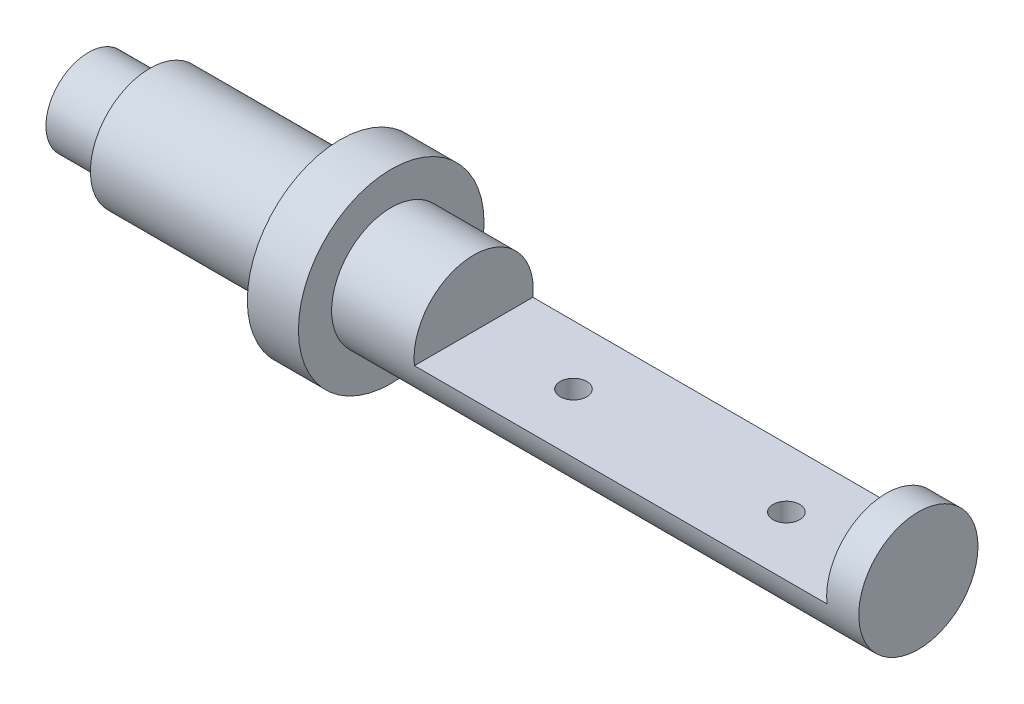
ISO-10303-21;
HEADER;
FILE_DESCRIPTION(('STEP AP214'),'2;1');
FILE_NAME('part.step','',(''),(''),'','','');
FILE_SCHEMA(('AUTOMOTIVE_DESIGN { 1 0 10303 214 1 1 1 1 }'));
ENDSEC;
DATA;
#1=APPLICATION_CONTEXT('core data for automotive mechanical design processes');
#2=APPLICATION_PROTOCOL_DEFINITION('international standard','automotive_design',2000,#1);
#3=PRODUCT_CONTEXT('',#1,'mechanical');
#4=PRODUCT('Part','Part','',(#3));
#5=PRODUCT_RELATED_PRODUCT_CATEGORY('part','',(#4));
#6=PRODUCT_DEFINITION_FORMATION('','',#4);
#7=PRODUCT_DEFINITION_CONTEXT('part definition',#1,'design');
#8=PRODUCT_DEFINITION('design','',#6,#7);
#9=PRODUCT_DEFINITION_SHAPE('','',#8);
#10=(LENGTH_UNIT() NAMED_UNIT(*) SI_UNIT(.MILLI.,.METRE.));
#11=(NAMED_UNIT(*) PLANE_ANGLE_UNIT() SI_UNIT($,.RADIAN.));
#12=(NAMED_UNIT(*) SI_UNIT($,.STERADIAN.) SOLID_ANGLE_UNIT());
#13=UNCERTAINTY_MEASURE_WITH_UNIT(LENGTH_MEASURE(1.E-05),#10,'distance_accuracy_value','');
#14=(GEOMETRIC_REPRESENTATION_CONTEXT(3) GLOBAL_UNCERTAINTY_ASSIGNED_CONTEXT((#13)) GLOBAL_UNIT_ASSIGNED_CONTEXT((#10,
#11,#12)) REPRESENTATION_CONTEXT('',''));
#15=CARTESIAN_POINT('',(0.,0.,0.));
#16=DIRECTION('',(0.,0.,1.));
#17=DIRECTION('',(1.,0.,0.));
#18=AXIS2_PLACEMENT_3D('',#15,#16,#17);
#19=CARTESIAN_POINT('',(0.,0.,0.));
#20=DIRECTION('',(-1.,0.,0.));
#21=DIRECTION('',(0.,0.,1.));
#22=AXIS2_PLACEMENT_3D('',#19,#20,#21);
#23=PLANE('',#22);
#24=CARTESIAN_POINT('',(0.,0.,0.));
#25=DIRECTION('',(1.,0.,0.));
#26=DIRECTION('',(0.,0.,-1.));
#27=AXIS2_PLACEMENT_3D('',#24,#25,#26);
#28=CIRCLE('',#27,20.);
#29=CARTESIAN_POINT('',(0.,0.,-20.));
#30=VERTEX_POINT('',#29);
#31=EDGE_CURVE('E107',#30,#30,#28,.T.);
#32=ORIENTED_EDGE('',*,*,#31,.F.);
#33=EDGE_LOOP('',(#32));
#34=FACE_BOUND('',#33,.T.);
#35=ADVANCED_FACE('F39',(#34),#23,.T.);
#36=CARTESIAN_POINT('',(389.8,0.,0.));
#37=DIRECTION('',(1.,0.,0.));
#38=DIRECTION('',(0.,0.,-1.));
#39=AXIS2_PLACEMENT_3D('',#36,#37,#38);
#40=CYLINDRICAL_SURFACE('',#39,20.);
#41=ORIENTED_EDGE('',*,*,#31,.T.);
#42=EDGE_LOOP('',(#41));
#43=FACE_BOUND('',#42,.T.);
#44=CARTESIAN_POINT('',(28.9,0.,0.));
#45=DIRECTION('',(1.,0.,0.));
#46=DIRECTION('',(0.,0.,-1.));
#47=AXIS2_PLACEMENT_3D('',#44,#45,#46);
#48=CIRCLE('',#47,20.);
#49=CARTESIAN_POINT('',(28.9,0.,-20.));
#50=VERTEX_POINT('',#49);
#51=EDGE_CURVE('E104',#50,#50,#48,.T.);
#52=ORIENTED_EDGE('',*,*,#51,.F.);
#53=EDGE_LOOP('',(#52));
#54=FACE_BOUND('',#53,.T.);
#55=ADVANCED_FACE('F157',(#43,#54),#40,.T.);
#56=CARTESIAN_POINT('',(28.9,20.,0.));
#57=DIRECTION('',(-1.,0.,0.));
#58=DIRECTION('',(0.,0.,1.));
#59=AXIS2_PLACEMENT_3D('',#56,#57,#58);
#60=PLANE('',#59);
#61=ORIENTED_EDGE('',*,*,#51,.T.);
#62=EDGE_LOOP('',(#61));
#63=FACE_BOUND('',#62,.T.);
#64=CARTESIAN_POINT('',(28.9,0.,0.));
#65=DIRECTION('',(1.,0.,0.));
#66=DIRECTION('',(0.,0.,-1.));
#67=AXIS2_PLACEMENT_3D('',#64,#65,#66);
#68=CIRCLE('',#67,28.);
#69=CARTESIAN_POINT('',(28.9,0.,-28.));
#70=VERTEX_POINT('',#69);
#71=EDGE_CURVE('E105',#70,#70,#68,.T.);
#72=ORIENTED_EDGE('',*,*,#71,.F.);
#73=EDGE_LOOP('',(#72));
#74=FACE_BOUND('',#73,.T.);
#75=ADVANCED_FACE('F163',(#63,#74),#60,.T.);
#76=CARTESIAN_POINT('',(389.8,0.,0.));
#77=DIRECTION('',(1.,0.,0.));
#78=DIRECTION('',(0.,0.,-1.));
#79=AXIS2_PLACEMENT_3D('',#76,#77,#78);
#80=CYLINDRICAL_SURFACE('',#79,28.);
#81=ORIENTED_EDGE('',*,*,#71,.T.);
#82=EDGE_LOOP('',(#81));
#83=FACE_BOUND('',#82,.T.);
#84=CARTESIAN_POINT('',(118.2,0.,0.));
#85=DIRECTION('',(1.,0.,0.));
#86=DIRECTION('',(0.,0.,-1.));
#87=AXIS2_PLACEMENT_3D('',#84,#85,#86);
#88=CIRCLE('',#87,28.);
#89=CARTESIAN_POINT('',(118.2,0.,-28.));
#90=VERTEX_POINT('',#89);
#91=EDGE_CURVE('E97',#90,#90,#88,.T.);
#92=ORIENTED_EDGE('',*,*,#91,.F.);
#93=EDGE_LOOP('',(#92));
#94=FACE_BOUND('',#93,.T.);
#95=ADVANCED_FACE('F175',(#83,#94),#80,.T.);
#96=CARTESIAN_POINT('',(118.2,28.,0.));
#97=DIRECTION('',(-1.,0.,0.));
#98=DIRECTION('',(0.,0.,1.));
#99=AXIS2_PLACEMENT_3D('',#96,#97,#98);
#100=PLANE('',#99);
#101=ORIENTED_EDGE('',*,*,#91,.T.);
#102=EDGE_LOOP('',(#101));
#103=FACE_BOUND('',#102,.T.);
#104=CARTESIAN_POINT('',(118.2,0.,0.));
#105=DIRECTION('',(1.,0.,0.));
#106=DIRECTION('',(0.,0.,-1.));
#107=AXIS2_PLACEMENT_3D('',#104,#105,#106);
#108=CIRCLE('',#107,43.6);
#109=CARTESIAN_POINT('',(118.2,0.,-43.6));
#110=VERTEX_POINT('',#109);
#111=EDGE_CURVE('E96',#110,#110,#108,.T.);
#112=ORIENTED_EDGE('',*,*,#111,.F.);
#113=EDGE_LOOP('',(#112));
#114=FACE_BOUND('',#113,.T.);
#115=ADVANCED_FACE('F179',(#103,#114),#100,.T.);
#116=CARTESIAN_POINT('',(389.8,0.,0.));
#117=DIRECTION('',(1.,0.,0.));
#118=DIRECTION('',(0.,0.,-1.));
#119=AXIS2_PLACEMENT_3D('',#116,#117,#118);
#120=CYLINDRICAL_SURFACE('',#119,43.6);
#121=ORIENTED_EDGE('',*,*,#111,.T.);
#122=EDGE_LOOP('',(#121));
#123=FACE_BOUND('',#122,.T.);
#124=CARTESIAN_POINT('',(142.2,0.,0.));
#125=DIRECTION('',(1.,0.,0.));
#126=DIRECTION('',(0.,0.,-1.));
#127=AXIS2_PLACEMENT_3D('',#124,#125,#126);
#128=CIRCLE('',#127,43.6);
#129=CARTESIAN_POINT('',(142.2,0.,-43.6));
#130=VERTEX_POINT('',#129);
#131=EDGE_CURVE('E89',#130,#130,#128,.T.);
#132=ORIENTED_EDGE('',*,*,#131,.F.);
#133=EDGE_LOOP('',(#132));
#134=FACE_BOUND('',#133,.T.);
#135=ADVANCED_FACE('F184',(#123,#134),#120,.T.);
#136=CARTESIAN_POINT('',(142.2,43.6,0.));
#137=DIRECTION('',(1.,0.,0.));
#138=DIRECTION('',(0.,0.,-1.));
#139=AXIS2_PLACEMENT_3D('',#136,#137,#138);
#140=PLANE('',#139);
#141=ORIENTED_EDGE('',*,*,#131,.T.);
#142=EDGE_LOOP('',(#141));
#143=FACE_BOUND('',#142,.T.);
#144=CARTESIAN_POINT('',(142.2,0.,0.));
#145=DIRECTION('',(1.,0.,0.));
#146=DIRECTION('',(0.,0.,-1.));
#147=AXIS2_PLACEMENT_3D('',#144,#145,#146);
#148=CIRCLE('',#147,28.);
#149=CARTESIAN_POINT('',(142.2,0.,-28.));
#150=VERTEX_POINT('',#149);
#151=EDGE_CURVE('E83',#150,#150,#148,.T.);
#152=ORIENTED_EDGE('',*,*,#151,.F.);
#153=EDGE_LOOP('',(#152));
#154=FACE_BOUND('',#153,.T.);
#155=ADVANCED_FACE('F76',(#143,#154),#140,.T.);
#156=CARTESIAN_POINT('',(389.8,0.,0.));
#157=DIRECTION('',(1.,0.,0.));
#158=DIRECTION('',(0.,0.,-1.));
#159=AXIS2_PLACEMENT_3D('',#156,#157,#158);
#160=CYLINDRICAL_SURFACE('',#159,28.);
#161=CARTESIAN_POINT('',(227.8,-27.2935431924841,6.25000000000001));
#162=CARTESIAN_POINT('',(227.626772759869,-27.2935406630598,6.25000418094473));
#163=CARTESIAN_POINT('',(227.453594583877,-27.295195294476,6.24279659776609));
#164=CARTESIAN_POINT('',(227.108445204921,-27.3017584796592,6.21403440350836));
#165=CARTESIAN_POINT('',(226.9364741812,-27.3066675067385,6.19247770552276));
#166=CARTESIAN_POINT('',(226.594963014681,-27.3195986301188,6.13517608334991));
#167=CARTESIAN_POINT('',(226.425423958102,-27.3276220751525,6.09942501198107));
#168=CARTESIAN_POINT('',(226.089985283219,-27.3465464155528,6.01400967245121));
#169=CARTESIAN_POINT('',(225.924087031793,-27.3574483722472,5.96434027208898));
#170=CARTESIAN_POINT('',(225.59739823919,-27.3817905916842,5.85156924300111));
#171=CARTESIAN_POINT('',(225.436600346177,-27.3952269869803,5.78848806167799));
#172=CARTESIAN_POINT('',(225.120879039308,-27.4242678496656,5.64929956777816));
#173=CARTESIAN_POINT('',(224.965957819931,-27.4398731170088,5.57318744653335));
#174=CARTESIAN_POINT('',(224.663139675886,-27.4728000717142,5.40853934345902));
#175=CARTESIAN_POINT('',(224.515239939892,-27.4901210633972,5.3200083911139));
#176=CARTESIAN_POINT('',(224.227304807542,-27.5260101395213,5.13108281812593));
#177=CARTESIAN_POINT('',(224.087272386179,-27.5445786899706,5.03068375356069));
#178=CARTESIAN_POINT('',(223.813935535353,-27.5827411710545,4.81708795276358));
#179=CARTESIAN_POINT('',(223.680768388947,-27.6023465077546,4.70371753740179));
#180=CARTESIAN_POINT('',(223.424367602939,-27.6417727676251,4.46619442991225));
#181=CARTESIAN_POINT('',(223.301137665901,-27.6615937680575,4.34203775433225));
#182=CARTESIAN_POINT('',(223.065523242344,-27.700889474895,4.08384197537747));
#183=CARTESIAN_POINT('',(222.953135671949,-27.7203642784752,3.94980570128881));
#184=CARTESIAN_POINT('',(222.739893741983,-27.7584430824459,3.67265674935637));
#185=CARTESIAN_POINT('',(222.639043646761,-27.7770467593695,3.52954074575632));
#186=CARTESIAN_POINT('',(222.448624564621,-27.813052346094,3.23365995739579));
#187=CARTESIAN_POINT('',(222.359186955487,-27.8304393713552,3.08080874634003));
#188=CARTESIAN_POINT('',(222.193497928413,-27.8633050823482,2.76785167600484));
#189=CARTESIAN_POINT('',(222.117251473738,-27.8787830491572,2.60774311456666));
#190=CARTESIAN_POINT('',(221.978606172387,-27.9073737582623,2.28150107379453));
#191=CARTESIAN_POINT('',(221.916200934247,-27.9204875917193,2.11537041669153));
#192=CARTESIAN_POINT('',(221.80567560503,-27.9439896454641,1.77823756423972));
#193=CARTESIAN_POINT('',(221.757560676261,-27.9543768806238,1.60723363283176));
#194=CARTESIAN_POINT('',(221.636694005375,-27.9806601200355,1.09439758323677));
#195=CARTESIAN_POINT('',(221.584988483422,-27.9921960538676,0.746994222027695));
#196=CARTESIAN_POINT('',(221.551534661022,-27.9996585490208,0.223520525139104));
#197=CARTESIAN_POINT('',(221.547741429726,-28.0005041840466,0.0485642360946108));
#198=CARTESIAN_POINT('',(221.554808971572,-27.9989265851301,-0.301058844425872));
#199=CARTESIAN_POINT('',(221.565669948848,-27.9965033056516,-0.475725631835141));
#200=CARTESIAN_POINT('',(221.619554977227,-27.9845298925051,-0.991080970449481));
#201=CARTESIAN_POINT('',(221.683476976027,-27.970364519702,-1.32971272514976));
#202=CARTESIAN_POINT('',(221.865716376935,-27.9310839487509,-1.99113945055508));
#203=CARTESIAN_POINT('',(221.984036304365,-27.9059682422566,-2.31393368526244));
#204=CARTESIAN_POINT('',(222.272613693557,-27.8472521946706,-2.93758195962187));
#205=CARTESIAN_POINT('',(222.443257248304,-27.813589111637,-3.23825157149131));
#206=CARTESIAN_POINT('',(222.831348644581,-27.7414625355303,-3.80704732566783));
#207=CARTESIAN_POINT('',(223.048803107967,-27.7029983636205,-4.07516885533361));
#208=CARTESIAN_POINT('',(223.529924683463,-27.6245113562129,-4.57738580559881));
#209=CARTESIAN_POINT('',(223.794490686191,-27.5844728055815,-4.81061849864796));
#210=CARTESIAN_POINT('',(224.359395719265,-27.5081274935843,-5.22957036099763));
#211=CARTESIAN_POINT('',(224.659735802028,-27.4718208420637,-5.41528813197722));
#212=CARTESIAN_POINT('',(225.28909832967,-27.4070063654905,-5.73434528879875));
#213=CARTESIAN_POINT('',(225.618209250125,-27.3785237986947,-5.86751562740583));
#214=CARTESIAN_POINT('',(226.294926272324,-27.3329281069129,-6.0763962250565));
#215=CARTESIAN_POINT('',(226.642529294842,-27.3158130954113,-6.15211601866804));
#216=CARTESIAN_POINT('',(227.338463469748,-27.2952766976966,-6.24259542089443));
#217=CARTESIAN_POINT('',(227.686622794773,-27.291572561069,-6.25861396727173));
#218=CARTESIAN_POINT('',(228.380637266418,-27.2975136372092,-6.23264970129104));
#219=CARTESIAN_POINT('',(228.726492576648,-27.3071578917232,-6.1906710524346));
#220=CARTESIAN_POINT('',(229.401658787116,-27.3384415167486,-6.05099829572651));
#221=CARTESIAN_POINT('',(229.731121853203,-27.3599303668854,-5.95400289682964));
#222=CARTESIAN_POINT('',(230.369119561196,-27.4123452195023,-5.70780773520875));
#223=CARTESIAN_POINT('',(230.677652128473,-27.4432721558189,-5.558602806482));
#224=CARTESIAN_POINT('',(231.270462153433,-27.5116960387506,-5.20947386615225));
#225=CARTESIAN_POINT('',(231.55427323904,-27.5492900747217,-5.00877748022631));
#226=CARTESIAN_POINT('',(232.084653800083,-27.6265592430673,-4.56335143969626));
#227=CARTESIAN_POINT('',(232.331218441614,-27.6662346446661,-4.31861607865893));
#228=CARTESIAN_POINT('',(232.78500466893,-27.7441297258463,-3.78641602648046));
#229=CARTESIAN_POINT('',(232.99136592114,-27.7823059698252,-3.49821158905157));
#230=CARTESIAN_POINT('',(233.352791761544,-27.8520981732881,-2.89029963896414));
#231=CARTESIAN_POINT('',(233.507858796504,-27.8837144456601,-2.57059362989548));
#232=CARTESIAN_POINT('',(233.697887719815,-27.9234467514472,-2.07570333708503));
#233=CARTESIAN_POINT('',(233.754038169116,-27.9353862929346,-1.90866854996698));
#234=CARTESIAN_POINT('',(233.852074197087,-27.9564443638961,-1.5703062834102));
#235=CARTESIAN_POINT('',(233.893965069283,-27.9655639400989,-1.39898042234163));
#236=CARTESIAN_POINT('',(233.963133940246,-27.9807181181667,-1.05326831573393));
#237=CARTESIAN_POINT('',(233.990410923789,-27.986752505703,-0.878881858444737));
#238=CARTESIAN_POINT('',(234.030124734713,-27.9955635060913,-0.528347318502385));
#239=CARTESIAN_POINT('',(234.042562155382,-27.9983402491843,-0.352199306560331));
#240=CARTESIAN_POINT('',(234.052382704856,-28.0005315872801,-0.00328258899926737));
#241=CARTESIAN_POINT('',(234.050085760547,-28.0000176335598,0.169476763448733));
#242=CARTESIAN_POINT('',(234.031205252523,-27.995809223028,0.514171279855253));
#243=CARTESIAN_POINT('',(234.014621979942,-27.9921148310289,0.686106460537331));
#244=CARTESIAN_POINT('',(233.967300889138,-27.9816470037884,1.02794898351234));
#245=CARTESIAN_POINT('',(233.936560840508,-27.9748730833677,1.19785600193809));
#246=CARTESIAN_POINT('',(233.861186498783,-27.9584357777394,1.53435186906264));
#247=CARTESIAN_POINT('',(233.816557147495,-27.9487734202847,1.70094187555776));
#248=CARTESIAN_POINT('',(233.71391333612,-27.9268574568711,2.02918872938449));
#249=CARTESIAN_POINT('',(233.655941549387,-27.9146121223051,2.19085948233514));
#250=CARTESIAN_POINT('',(233.526996614568,-27.8878471112107,2.50866639727834));
#251=CARTESIAN_POINT('',(233.456028036642,-27.8733282344044,2.66480448180282));
#252=CARTESIAN_POINT('',(233.301559769507,-27.8423945526457,2.97063998638385));
#253=CARTESIAN_POINT('',(233.218054753125,-27.825978942391,3.12033463343336));
#254=CARTESIAN_POINT('',(233.039153331803,-27.7916988602937,3.41219288944288));
#255=CARTESIAN_POINT('',(232.943760941799,-27.7738348783443,3.55435901815253));
#256=CARTESIAN_POINT('',(232.739680676553,-27.7367568229686,3.8330774015288));
#257=CARTESIAN_POINT('',(232.630764581969,-27.7175228620527,3.96945995543578));
#258=CARTESIAN_POINT('',(232.401992902721,-27.67856827949,4.23255724998559));
#259=CARTESIAN_POINT('',(232.282141120766,-27.6588478287394,4.35927532336926));
#260=CARTESIAN_POINT('',(232.032190697746,-27.6194442852869,4.60233284521467));
#261=CARTESIAN_POINT('',(231.902085955803,-27.5997612220746,4.71866602514742));
#262=CARTESIAN_POINT('',(231.632602018594,-27.5609972321727,4.94004645388393));
#263=CARTESIAN_POINT('',(231.493226229135,-27.5419160881187,5.04509781049819));
#264=CARTESIAN_POINT('',(231.203995171382,-27.5046146614129,5.24467646780602));
#265=CARTESIAN_POINT('',(231.054017467704,-27.4864108262582,5.33902953184628));
#266=CARTESIAN_POINT('',(230.746502220708,-27.4517038520394,5.51470510633685));
#267=CARTESIAN_POINT('',(230.588967489404,-27.4352000874544,5.59603241561453));
#268=CARTESIAN_POINT('',(230.267459281152,-27.4043843599853,5.74504238460735));
#269=CARTESIAN_POINT('',(230.103489319597,-27.3900712207976,5.81273237339837));
#270=CARTESIAN_POINT('',(229.77025885759,-27.364060344737,5.93397254806087));
#271=CARTESIAN_POINT('',(229.6009992932,-27.3523621480711,5.987525220039));
#272=CARTESIAN_POINT('',(229.164711263261,-27.3263643748796,6.10534932009698));
#273=CARTESIAN_POINT('',(228.894756275629,-27.3141314337926,6.15951030297508));
#274=CARTESIAN_POINT('',(228.349826175448,-27.2977230622745,6.2318313742948));
#275=CARTESIAN_POINT('',(228.074851329116,-27.2935472058001,6.24999336629613));
#276=CARTESIAN_POINT('',(227.8,-27.2935431924841,6.25000000000001));
#277=B_SPLINE_CURVE_WITH_KNOTS('',3,(#161,#162,#163,#164,#165,#166,#167,#168,#169,#170,#171,
#172,#173,#174,#175,#176,#177,#178,#179,#180,#181,#182,#183,#184,#185,#186,#187,#188,#189,#190,
#191,#192,#193,#194,#195,#196,#197,#198,#199,#200,#201,#202,#203,#204,#205,#206,#207,#208,#209,
#210,#211,#212,#213,#214,#215,#216,#217,#218,#219,#220,#221,#222,#223,#224,#225,#226,#227,#228,
#229,#230,#231,#232,#233,#234,#235,#236,#237,#238,#239,#240,#241,#242,#243,#244,#245,#246,#247,
#248,#249,#250,#251,#252,#253,#254,#255,#256,#257,#258,#259,#260,#261,#262,#263,#264,#265,#266,
#267,#268,#269,#270,#271,#272,#273,#274,#275,#276),.UNSPECIFIED.,.T.,.F.,(4,2,2,2,2,2,2,2,2,2,2,
2,2,2,2,2,2,2,2,2,2,2,2,2,2,2,2,2,2,2,2,2,2,2,2,2,2,2,2,2,2,2,2,2,2,2,2,2,2,2,2,2,2,2,2,2,2,4),
(0.,0.519439608500111,1.0389547797675,1.55869518419964,2.07862748884636,2.59777272482057,
3.1171099499522,3.63623745343965,4.1555599596157,4.68290174643604,5.21043911948483,
5.73782600077029,6.26540718315176,6.79859906273959,7.33199112529032,7.86513636801498,
8.39847397341277,9.44659898859371,9.97108019976339,10.4955687170816,11.5250017072293,
12.5544824917318,13.5917504134608,14.6291651632887,15.6890487552905,16.7489635351156,
17.8122608342571,18.8753816285583,19.9159529707268,20.9564496162611,21.9840187566687,
23.0116896012437,24.0557822772237,25.10001034103,26.1645877935076,27.229114457624,
27.7584522517355,28.2875933270914,28.8167711569939,29.3459278295956,29.8636344148691,
30.3813304503266,30.8991080770091,31.4167016888243,31.9326623270648,32.4484418813475,
32.9644412321529,33.4802667751747,34.0064342303606,34.5324194115064,35.0587199707588,
35.5848282449849,36.1185476697549,36.6520700120354,37.1853048551527,37.7184458641198,
38.542659288208,39.3668291282597),.UNSPECIFIED.);
#278=CARTESIAN_POINT('',(227.8,-27.2935431924841,6.25000000000001));
#279=VERTEX_POINT('',#278);
#280=EDGE_CURVE('E118',#279,#279,#277,.T.);
#281=ORIENTED_EDGE('',*,*,#280,.F.);
#282=EDGE_LOOP('',(#281));
#283=FACE_BOUND('',#282,.T.);
#284=CARTESIAN_POINT('',(327.8,-27.2935431924841,6.25000000000003));
#285=CARTESIAN_POINT('',(327.626772759869,-27.2935406630598,6.25000418094476));
#286=CARTESIAN_POINT('',(327.453594583877,-27.295195294476,6.24279659776612));
#287=CARTESIAN_POINT('',(327.108445204921,-27.3017584796592,6.21403440350839));
#288=CARTESIAN_POINT('',(326.9364741812,-27.3066675067385,6.19247770552278));
#289=CARTESIAN_POINT('',(326.594963014681,-27.3195986301188,6.13517608334994));
#290=CARTESIAN_POINT('',(326.425423958102,-27.3276220751525,6.09942501198109));
#291=CARTESIAN_POINT('',(326.089985283219,-27.3465464155528,6.01400967245123));
#292=CARTESIAN_POINT('',(325.924087031793,-27.3574483722472,5.964340272089));
#293=CARTESIAN_POINT('',(325.59739823919,-27.3817905916842,5.85156924300113));
#294=CARTESIAN_POINT('',(325.436600346177,-27.3952269869803,5.78848806167802));
#295=CARTESIAN_POINT('',(325.120879039308,-27.4242678496656,5.64929956777819));
#296=CARTESIAN_POINT('',(324.965957819931,-27.4398731170088,5.57318744653339));
#297=CARTESIAN_POINT('',(324.663139675886,-27.4728000717142,5.40853934345906));
#298=CARTESIAN_POINT('',(324.515239939892,-27.4901210633972,5.32000839111395));
#299=CARTESIAN_POINT('',(324.227304807542,-27.5260101395213,5.13108281812598));
#300=CARTESIAN_POINT('',(324.087272386179,-27.5445786899706,5.03068375356074));
#301=CARTESIAN_POINT('',(323.813935535353,-27.5827411710544,4.81708795276363));
#302=CARTESIAN_POINT('',(323.680768388947,-27.6023465077546,4.70371753740185));
#303=CARTESIAN_POINT('',(323.424367602939,-27.6417727676251,4.46619442991232));
#304=CARTESIAN_POINT('',(323.301137665901,-27.6615937680575,4.3420377543323));
#305=CARTESIAN_POINT('',(323.065523242344,-27.700889474895,4.08384197537751));
#306=CARTESIAN_POINT('',(322.953135671949,-27.7203642784752,3.94980570128885));
#307=CARTESIAN_POINT('',(322.739893741983,-27.7584430824459,3.67265674935641));
#308=CARTESIAN_POINT('',(322.639043646761,-27.7770467593695,3.52954074575636));
#309=CARTESIAN_POINT('',(322.448624564621,-27.813052346094,3.23365995739585));
#310=CARTESIAN_POINT('',(322.359186955487,-27.8304393713551,3.08080874634009));
#311=CARTESIAN_POINT('',(322.193497928413,-27.8633050823482,2.7678516760049));
#312=CARTESIAN_POINT('',(322.117251473738,-27.8787830491572,2.60774311456671));
#313=CARTESIAN_POINT('',(321.978606172387,-27.9073737582623,2.28150107379458));
#314=CARTESIAN_POINT('',(321.916200934247,-27.9204875917193,2.11537041669158));
#315=CARTESIAN_POINT('',(321.80567560503,-27.9439896454641,1.77823756423976));
#316=CARTESIAN_POINT('',(321.757560676261,-27.9543768806238,1.6072336328318));
#317=CARTESIAN_POINT('',(321.636694005375,-27.9806601200355,1.09439758323679));
#318=CARTESIAN_POINT('',(321.584988483422,-27.9921960538676,0.746994222027709));
#319=CARTESIAN_POINT('',(321.551534661022,-27.9996585490208,0.223520525139109));
#320=CARTESIAN_POINT('',(321.547741429726,-28.0005041840466,0.0485642360946131));
#321=CARTESIAN_POINT('',(321.554808971572,-27.9989265851301,-0.301058844425877));
#322=CARTESIAN_POINT('',(321.565669948848,-27.9965033056516,-0.47572563183515));
#323=CARTESIAN_POINT('',(321.619554977227,-27.9845298925051,-0.991080970449496));
#324=CARTESIAN_POINT('',(321.683476976027,-27.970364519702,-1.32971272514978));
#325=CARTESIAN_POINT('',(321.865716376935,-27.9310839487509,-1.9911394505551));
#326=CARTESIAN_POINT('',(321.984036304365,-27.9059682422566,-2.31393368526247));
#327=CARTESIAN_POINT('',(322.272613693557,-27.8472521946706,-2.93758195962189));
#328=CARTESIAN_POINT('',(322.443257248304,-27.813589111637,-3.23825157149134));
#329=CARTESIAN_POINT('',(322.831348644581,-27.7414625355303,-3.80704732566786));
#330=CARTESIAN_POINT('',(323.048803107967,-27.7029983636205,-4.07516885533364));
#331=CARTESIAN_POINT('',(323.529924683463,-27.6245113562129,-4.57738580559885));
#332=CARTESIAN_POINT('',(323.794490686192,-27.5844728055815,-4.81061849864799));
#333=CARTESIAN_POINT('',(324.359395719265,-27.5081274935843,-5.22957036099767));
#334=CARTESIAN_POINT('',(324.659735802028,-27.4718208420637,-5.41528813197726));
#335=CARTESIAN_POINT('',(325.28909832967,-27.4070063654905,-5.73434528879879));
#336=CARTESIAN_POINT('',(325.618209250125,-27.3785237986947,-5.86751562740587));
#337=CARTESIAN_POINT('',(326.294926272324,-27.3329281069129,-6.07639622505653));
#338=CARTESIAN_POINT('',(326.642529294842,-27.3158130954113,-6.15211601866807));
#339=CARTESIAN_POINT('',(327.338463469748,-27.2952766976966,-6.24259542089446));
#340=CARTESIAN_POINT('',(327.686622794773,-27.291572561069,-6.25861396727175));
#341=CARTESIAN_POINT('',(328.380637266418,-27.2975136372092,-6.23264970129107));
#342=CARTESIAN_POINT('',(328.726492576648,-27.3071578917232,-6.19067105243462));
#343=CARTESIAN_POINT('',(329.401658787116,-27.3384415167486,-6.05099829572654));
#344=CARTESIAN_POINT('',(329.731121853203,-27.3599303668854,-5.95400289682967));
#345=CARTESIAN_POINT('',(330.369119561196,-27.4123452195023,-5.70780773520877));
#346=CARTESIAN_POINT('',(330.677652128473,-27.4432721558189,-5.55860280648202));
#347=CARTESIAN_POINT('',(331.270462153433,-27.5116960387506,-5.20947386615228));
#348=CARTESIAN_POINT('',(331.554273239041,-27.5492900747216,-5.00877748022635));
#349=CARTESIAN_POINT('',(332.084653800083,-27.6265592430672,-4.5633514396963));
#350=CARTESIAN_POINT('',(332.331218441614,-27.6662346446661,-4.31861607865894));
#351=CARTESIAN_POINT('',(332.78500466893,-27.7441297258462,-3.78641602648045));
#352=CARTESIAN_POINT('',(332.99136592114,-27.7823059698252,-3.49821158905157));
#353=CARTESIAN_POINT('',(333.352791761544,-27.8520981732881,-2.89029963896414));
#354=CARTESIAN_POINT('',(333.507858796504,-27.8837144456601,-2.57059362989546));
#355=CARTESIAN_POINT('',(333.697887719815,-27.9234467514472,-2.075703337085));
#356=CARTESIAN_POINT('',(333.754038169116,-27.9353862929346,-1.90866854996695));
#357=CARTESIAN_POINT('',(333.852074197087,-27.9564443638961,-1.57030628341017));
#358=CARTESIAN_POINT('',(333.893965069283,-27.9655639400989,-1.39898042234161));
#359=CARTESIAN_POINT('',(333.963133940246,-27.9807181181667,-1.05326831573391));
#360=CARTESIAN_POINT('',(333.990410923789,-27.986752505703,-0.87888185844472));
#361=CARTESIAN_POINT('',(334.030124734713,-27.9955635060913,-0.528347318502367));
#362=CARTESIAN_POINT('',(334.042562155382,-27.9983402491843,-0.352199306560314));
#363=CARTESIAN_POINT('',(334.052382704856,-28.0005315872801,-0.00328258899925384));
#364=CARTESIAN_POINT('',(334.050085760547,-28.0000176335598,0.169476763448743));
#365=CARTESIAN_POINT('',(334.031205252523,-27.995809223028,0.514171279855259));
#366=CARTESIAN_POINT('',(334.014621979942,-27.9921148310289,0.686106460537337));
#367=CARTESIAN_POINT('',(333.967300889138,-27.9816470037884,1.02794898351235));
#368=CARTESIAN_POINT('',(333.936560840508,-27.9748730833677,1.1978560019381));
#369=CARTESIAN_POINT('',(333.861186498783,-27.9584357777394,1.53435186906265));
#370=CARTESIAN_POINT('',(333.816557147495,-27.9487734202847,1.70094187555778));
#371=CARTESIAN_POINT('',(333.71391333612,-27.9268574568711,2.02918872938451));
#372=CARTESIAN_POINT('',(333.655941549387,-27.9146121223051,2.19085948233516));
#373=CARTESIAN_POINT('',(333.526996614568,-27.8878471112107,2.50866639727836));
#374=CARTESIAN_POINT('',(333.456028036642,-27.8733282344044,2.66480448180285));
#375=CARTESIAN_POINT('',(333.301559769507,-27.8423945526457,2.9706399863839));
#376=CARTESIAN_POINT('',(333.218054753125,-27.825978942391,3.12033463343341));
#377=CARTESIAN_POINT('',(333.039153331803,-27.7916988602937,3.41219288944293));
#378=CARTESIAN_POINT('',(332.943760941799,-27.7738348783443,3.55435901815256));
#379=CARTESIAN_POINT('',(332.739680676553,-27.7367568229686,3.83307740152882));
#380=CARTESIAN_POINT('',(332.63076458197,-27.7175228620527,3.9694599554358));
#381=CARTESIAN_POINT('',(332.401992902721,-27.67856827949,4.23255724998561));
#382=CARTESIAN_POINT('',(332.282141120766,-27.6588478287394,4.35927532336929));
#383=CARTESIAN_POINT('',(332.032190697746,-27.6194442852869,4.60233284521469));
#384=CARTESIAN_POINT('',(331.902085955803,-27.5997612220746,4.71866602514742));
#385=CARTESIAN_POINT('',(331.632602018594,-27.5609972321727,4.94004645388394));
#386=CARTESIAN_POINT('',(331.493226229136,-27.5419160881187,5.0450978104982));
#387=CARTESIAN_POINT('',(331.203995171382,-27.5046146614129,5.24467646780604));
#388=CARTESIAN_POINT('',(331.054017467704,-27.4864108262582,5.3390295318463));
#389=CARTESIAN_POINT('',(330.746502220708,-27.4517038520394,5.51470510633687));
#390=CARTESIAN_POINT('',(330.588967489404,-27.4352000874544,5.59603241561455));
#391=CARTESIAN_POINT('',(330.267459281153,-27.4043843599853,5.74504238460738));
#392=CARTESIAN_POINT('',(330.103489319597,-27.3900712207976,5.8127323733984));
#393=CARTESIAN_POINT('',(329.77025885759,-27.364060344737,5.93397254806091));
#394=CARTESIAN_POINT('',(329.6009992932,-27.3523621480711,5.98752522003903));
#395=CARTESIAN_POINT('',(329.164711263261,-27.3263643748796,6.10534932009699));
#396=CARTESIAN_POINT('',(328.894756275629,-27.3141314337926,6.15951030297511));
#397=CARTESIAN_POINT('',(328.349826175448,-27.2977230622745,6.23183137429483));
#398=CARTESIAN_POINT('',(328.074851329116,-27.2935472058001,6.24999336629615));
#399=CARTESIAN_POINT('',(327.8,-27.2935431924841,6.25000000000003));
#400=B_SPLINE_CURVE_WITH_KNOTS('',3,(#284,#285,#286,#287,#288,#289,#290,#291,#292,#293,#294,
#295,#296,#297,#298,#299,#300,#301,#302,#303,#304,#305,#306,#307,#308,#309,#310,#311,#312,#313,
#314,#315,#316,#317,#318,#319,#320,#321,#322,#323,#324,#325,#326,#327,#328,#329,#330,#331,#332,
#333,#334,#335,#336,#337,#338,#339,#340,#341,#342,#343,#344,#345,#346,#347,#348,#349,#350,#351,
#352,#353,#354,#355,#356,#357,#358,#359,#360,#361,#362,#363,#364,#365,#366,#367,#368,#369,#370,
#371,#372,#373,#374,#375,#376,#377,#378,#379,#380,#381,#382,#383,#384,#385,#386,#387,#388,#389,
#390,#391,#392,#393,#394,#395,#396,#397,#398,#399),.UNSPECIFIED.,.T.,.F.,(4,2,2,2,2,2,2,2,2,2,2,
2,2,2,2,2,2,2,2,2,2,2,2,2,2,2,2,2,2,2,2,2,2,2,2,2,2,2,2,2,2,2,2,2,2,2,2,2,2,2,2,2,2,2,2,2,2,4),
(0.,0.519439608500111,1.03895477976747,1.55869518419967,2.07862748884639,2.59777272482059,
3.11710994995217,3.6362374534396,4.15555995961564,4.68290174643602,5.21043911948482,
5.73782600077029,6.26540718315175,6.79859906273955,7.33199112529028,7.86513636801497,
8.39847397341278,9.44659898859374,9.97108019976343,10.4955687170816,11.5250017072293,
12.5544824917318,13.5917504134609,14.6291651632888,15.6890487552907,16.7489635351157,
17.8122608342572,18.8753816285584,19.9159529707268,20.9564496162612,21.9840187566688,
23.0116896012438,24.0557822772238,25.1000103410301,26.1645877935078,27.2291144576241,
27.7584522517357,28.2875933270915,28.816771156994,29.3459278295958,29.8636344148692,
30.3813304503267,30.8991080770092,31.4167016888245,31.932662327065,32.4484418813477,
32.964441232153,33.4802667751749,34.0064342303608,34.5324194115066,35.0587199707589,
35.5848282449851,36.1185476697551,36.6520700120356,37.1853048551529,37.71844586412,
38.5426592882081,39.3668291282599),.UNSPECIFIED.);
#401=CARTESIAN_POINT('',(327.8,-27.2935431924841,6.25000000000003));
#402=VERTEX_POINT('',#401);
#403=EDGE_CURVE('E114',#402,#402,#400,.T.);
#404=ORIENTED_EDGE('',*,*,#403,.F.);
#405=EDGE_LOOP('',(#404));
#406=FACE_BOUND('',#405,.T.);
#407=DIRECTION('',(1.,0.,0.));
#408=VECTOR('',#407,1.);
#409=CARTESIAN_POINT('',(389.8,-3.10000000000005,-27.8278637340346));
#410=LINE('',#409,#408);
#411=CARTESIAN_POINT('',(374.7,-3.10000000000005,-27.8278637340346));
#412=VERTEX_POINT('',#411);
#413=CARTESIAN_POINT('',(180.9,-3.10000000000005,-27.8278637340346));
#414=VERTEX_POINT('',#413);
#415=EDGE_CURVE('E11',#412,#414,#410,.F.);
#416=ORIENTED_EDGE('',*,*,#415,.F.);
#417=CARTESIAN_POINT('',(374.7,0.,0.));
#418=DIRECTION('',(1.,0.,0.));
#419=DIRECTION('',(0.,0.,-1.));
#420=AXIS2_PLACEMENT_3D('',#417,#418,#419);
#421=CIRCLE('',#420,28.);
#422=CARTESIAN_POINT('',(374.7,-3.10000000000005,27.8278637340346));
#423=VERTEX_POINT('',#422);
#424=EDGE_CURVE('E67',#423,#412,#421,.F.);
#425=ORIENTED_EDGE('',*,*,#424,.F.);
#426=DIRECTION('',(1.,0.,0.));
#427=VECTOR('',#426,1.);
#428=CARTESIAN_POINT('',(389.8,-3.10000000000005,27.8278637340346));
#429=LINE('',#428,#427);
#430=CARTESIAN_POINT('',(180.9,-3.10000000000005,27.8278637340346));
#431=VERTEX_POINT('',#430);
#432=EDGE_CURVE('E68',#431,#423,#429,.T.);
#433=ORIENTED_EDGE('',*,*,#432,.F.);
#434=CARTESIAN_POINT('',(180.9,0.,0.));
#435=DIRECTION('',(-1.,0.,0.));
#436=DIRECTION('',(0.,0.,1.));
#437=AXIS2_PLACEMENT_3D('',#434,#435,#436);
#438=CIRCLE('',#437,28.);
#439=EDGE_CURVE('E46',#414,#431,#438,.F.);
#440=ORIENTED_EDGE('',*,*,#439,.F.);
#441=EDGE_LOOP('',(#416,#425,#433,#440));
#442=FACE_BOUND('',#441,.T.);
#443=ORIENTED_EDGE('',*,*,#151,.T.);
#444=EDGE_LOOP('',(#443));
#445=FACE_BOUND('',#444,.T.);
#446=CARTESIAN_POINT('',(389.8,0.,0.));
#447=DIRECTION('',(1.,0.,0.));
#448=DIRECTION('',(0.,0.,-1.));
#449=AXIS2_PLACEMENT_3D('',#446,#447,#448);
#450=CIRCLE('',#449,28.);
#451=CARTESIAN_POINT('',(389.8,0.,-28.));
#452=VERTEX_POINT('',#451);
#453=EDGE_CURVE('E71',#452,#452,#450,.T.);
#454=ORIENTED_EDGE('',*,*,#453,.F.);
#455=EDGE_LOOP('',(#454));
#456=FACE_BOUND('',#455,.T.);
#457=ADVANCED_FACE('F73',(#283,#406,#442,#445,#456),#160,.T.);
#458=CARTESIAN_POINT('',(389.8,28.,0.));
#459=DIRECTION('',(1.,0.,0.));
#460=DIRECTION('',(0.,0.,-1.));
#461=AXIS2_PLACEMENT_3D('',#458,#459,#460);
#462=PLANE('',#461);
#463=ORIENTED_EDGE('',*,*,#453,.T.);
#464=EDGE_LOOP('',(#463));
#465=FACE_BOUND('',#464,.T.);
#466=ADVANCED_FACE('F79',(#465),#462,.T.);
#467=CARTESIAN_POINT('',(180.9,28.,-43.6));
#468=DIRECTION('',(-1.,0.,0.));
#469=DIRECTION('',(0.,0.,1.));
#470=AXIS2_PLACEMENT_3D('',#467,#468,#469);
#471=PLANE('',#470);
#472=DIRECTION('',(0.,0.,1.));
#473=VECTOR('',#472,1.);
#474=CARTESIAN_POINT('',(180.9,-3.10000000000005,-43.6));
#475=LINE('',#474,#473);
#476=EDGE_CURVE('E55',#414,#431,#475,.T.);
#477=ORIENTED_EDGE('',*,*,#476,.F.);
#478=ORIENTED_EDGE('',*,*,#439,.T.);
#479=EDGE_LOOP('',(#477,#478));
#480=FACE_BOUND('',#479,.T.);
#481=ADVANCED_FACE('F115',(#480),#471,.F.);
#482=CARTESIAN_POINT('',(374.7,28.,-43.6));
#483=DIRECTION('',(1.,0.,0.));
#484=DIRECTION('',(0.,0.,-1.));
#485=AXIS2_PLACEMENT_3D('',#482,#483,#484);
#486=PLANE('',#485);
#487=ORIENTED_EDGE('',*,*,#424,.T.);
#488=DIRECTION('',(0.,0.,1.));
#489=VECTOR('',#488,1.);
#490=CARTESIAN_POINT('',(374.7,-3.10000000000005,-43.6));
#491=LINE('',#490,#489);
#492=EDGE_CURVE('E66',#412,#423,#491,.T.);
#493=ORIENTED_EDGE('',*,*,#492,.T.);
#494=EDGE_LOOP('',(#487,#493));
#495=FACE_BOUND('',#494,.T.);
#496=ADVANCED_FACE('F69',(#495),#486,.F.);
#497=CARTESIAN_POINT('',(180.9,-3.10000000000005,-43.6));
#498=DIRECTION('',(0.,-1.,0.));
#499=DIRECTION('',(0.,0.,-1.));
#500=AXIS2_PLACEMENT_3D('',#497,#498,#499);
#501=PLANE('',#500);
#502=CARTESIAN_POINT('',(227.8,-3.10000000000005,0.));
#503=DIRECTION('',(0.,1.,0.));
#504=DIRECTION('',(0.,0.,1.));
#505=AXIS2_PLACEMENT_3D('',#502,#503,#504);
#506=CIRCLE('',#505,6.25000000000001);
#507=CARTESIAN_POINT('',(227.8,-3.10000000000005,6.25000000000001));
#508=VERTEX_POINT('',#507);
#509=EDGE_CURVE('E145',#508,#508,#506,.T.);
#510=ORIENTED_EDGE('',*,*,#509,.F.);
#511=EDGE_LOOP('',(#510));
#512=FACE_BOUND('',#511,.T.);
#513=CARTESIAN_POINT('',(327.8,-3.10000000000005,0.));
#514=DIRECTION('',(0.,1.,0.));
#515=DIRECTION('',(0.,0.,1.));
#516=AXIS2_PLACEMENT_3D('',#513,#514,#515);
#517=CIRCLE('',#516,6.25000000000003);
#518=CARTESIAN_POINT('',(327.8,-3.10000000000005,6.25000000000003));
#519=VERTEX_POINT('',#518);
#520=EDGE_CURVE('E113',#519,#519,#517,.T.);
#521=ORIENTED_EDGE('',*,*,#520,.F.);
#522=EDGE_LOOP('',(#521));
#523=FACE_BOUND('',#522,.T.);
#524=ORIENTED_EDGE('',*,*,#415,.T.);
#525=ORIENTED_EDGE('',*,*,#476,.T.);
#526=ORIENTED_EDGE('',*,*,#432,.T.);
#527=ORIENTED_EDGE('',*,*,#492,.F.);
#528=EDGE_LOOP('',(#524,#525,#526,#527));
#529=FACE_BOUND('',#528,.T.);
#530=ADVANCED_FACE('F75',(#512,#523,#529),#501,.F.);
#531=CARTESIAN_POINT('',(327.8,-3.10000000000005,0.));
#532=DIRECTION('',(0.,1.,0.));
#533=DIRECTION('',(0.,0.,1.));
#534=AXIS2_PLACEMENT_3D('',#531,#532,#533);
#535=CYLINDRICAL_SURFACE('',#534,6.25000000000003);
#536=ORIENTED_EDGE('',*,*,#520,.T.);
#537=EDGE_LOOP('',(#536));
#538=FACE_BOUND('',#537,.T.);
#539=ORIENTED_EDGE('',*,*,#403,.T.);
#540=EDGE_LOOP('',(#539));
#541=FACE_BOUND('',#540,.T.);
#542=ADVANCED_FACE('F128',(#538,#541),#535,.F.);
#543=CARTESIAN_POINT('',(227.8,-3.10000000000005,0.));
#544=DIRECTION('',(0.,1.,0.));
#545=DIRECTION('',(0.,0.,1.));
#546=AXIS2_PLACEMENT_3D('',#543,#544,#545);
#547=CYLINDRICAL_SURFACE('',#546,6.25000000000001);
#548=ORIENTED_EDGE('',*,*,#509,.T.);
#549=EDGE_LOOP('',(#548));
#550=FACE_BOUND('',#549,.T.);
#551=ORIENTED_EDGE('',*,*,#280,.T.);
#552=EDGE_LOOP('',(#551));
#553=FACE_BOUND('',#552,.T.);
#554=ADVANCED_FACE('F131',(#550,#553),#547,.F.);
#555=CLOSED_SHELL('',(#35,#55,#75,#95,#115,#135,#155,#457,#466,#481,#496,#530,#542,#554));
#556=MANIFOLD_SOLID_BREP('B2',#555);
#557=ADVANCED_BREP_SHAPE_REPRESENTATION('',(#18,#556),#14);
#558=SHAPE_DEFINITION_REPRESENTATION(#9,#557);
ENDSEC;
END-ISO-10303-21;
